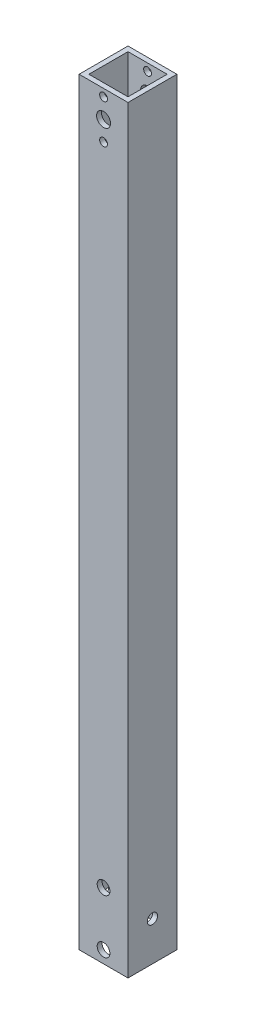
ISO-10303-21;
HEADER;
FILE_DESCRIPTION(('STEP AP214'),'2;1');
FILE_NAME('part.step','',(''),(''),'','','');
FILE_SCHEMA(('AUTOMOTIVE_DESIGN { 1 0 10303 214 1 1 1 1 }'));
ENDSEC;
DATA;
#1=APPLICATION_CONTEXT('core data for automotive mechanical design processes');
#2=APPLICATION_PROTOCOL_DEFINITION('international standard','automotive_design',2000,#1);
#3=PRODUCT_CONTEXT('',#1,'mechanical');
#4=PRODUCT('Part','Part','',(#3));
#5=PRODUCT_RELATED_PRODUCT_CATEGORY('part','',(#4));
#6=PRODUCT_DEFINITION_FORMATION('','',#4);
#7=PRODUCT_DEFINITION_CONTEXT('part definition',#1,'design');
#8=PRODUCT_DEFINITION('design','',#6,#7);
#9=PRODUCT_DEFINITION_SHAPE('','',#8);
#10=(LENGTH_UNIT() NAMED_UNIT(*) SI_UNIT(.MILLI.,.METRE.));
#11=(NAMED_UNIT(*) PLANE_ANGLE_UNIT() SI_UNIT($,.RADIAN.));
#12=(NAMED_UNIT(*) SI_UNIT($,.STERADIAN.) SOLID_ANGLE_UNIT());
#13=UNCERTAINTY_MEASURE_WITH_UNIT(LENGTH_MEASURE(1.E-05),#10,'distance_accuracy_value','');
#14=(GEOMETRIC_REPRESENTATION_CONTEXT(3) GLOBAL_UNCERTAINTY_ASSIGNED_CONTEXT((#13)) GLOBAL_UNIT_ASSIGNED_CONTEXT((#10,
#11,#12)) REPRESENTATION_CONTEXT('',''));
#15=CARTESIAN_POINT('',(0.,0.,0.));
#16=DIRECTION('',(0.,0.,1.));
#17=DIRECTION('',(1.,0.,0.));
#18=AXIS2_PLACEMENT_3D('',#15,#16,#17);
#19=CARTESIAN_POINT('',(0.,310.,0.));
#20=DIRECTION('',(0.,1.,0.));
#21=DIRECTION('',(0.,0.,1.));
#22=AXIS2_PLACEMENT_3D('',#19,#20,#21);
#23=PLANE('',#22);
#24=DIRECTION('',(0.,0.,1.));
#25=VECTOR('',#24,1.);
#26=CARTESIAN_POINT('',(0.,310.,0.));
#27=LINE('',#26,#25);
#28=CARTESIAN_POINT('',(0.,310.,-20.));
#29=VERTEX_POINT('',#28);
#30=CARTESIAN_POINT('',(0.,310.,0.));
#31=VERTEX_POINT('',#30);
#32=EDGE_CURVE('E162',#29,#31,#27,.T.);
#33=ORIENTED_EDGE('',*,*,#32,.T.);
#34=DIRECTION('',(1.,0.,0.));
#35=VECTOR('',#34,1.);
#36=CARTESIAN_POINT('',(0.,310.,0.));
#37=LINE('',#36,#35);
#38=CARTESIAN_POINT('',(20.,310.,0.));
#39=VERTEX_POINT('',#38);
#40=EDGE_CURVE('E165',#31,#39,#37,.T.);
#41=ORIENTED_EDGE('',*,*,#40,.T.);
#42=DIRECTION('',(0.,0.,-1.));
#43=VECTOR('',#42,1.);
#44=CARTESIAN_POINT('',(20.,310.,0.));
#45=LINE('',#44,#43);
#46=CARTESIAN_POINT('',(20.,310.,-20.));
#47=VERTEX_POINT('',#46);
#48=EDGE_CURVE('E168',#39,#47,#45,.T.);
#49=ORIENTED_EDGE('',*,*,#48,.T.);
#50=DIRECTION('',(-1.,0.,0.));
#51=VECTOR('',#50,1.);
#52=CARTESIAN_POINT('',(0.,310.,-20.));
#53=LINE('',#52,#51);
#54=EDGE_CURVE('E170',#47,#29,#53,.T.);
#55=ORIENTED_EDGE('',*,*,#54,.T.);
#56=EDGE_LOOP('',(#33,#41,#49,#55));
#57=FACE_BOUND('',#56,.T.);
#58=DIRECTION('',(1.,0.,0.));
#59=VECTOR('',#58,1.);
#60=CARTESIAN_POINT('',(0.,310.,-2.));
#61=LINE('',#60,#59);
#62=CARTESIAN_POINT('',(2.,310.,-2.));
#63=VERTEX_POINT('',#62);
#64=CARTESIAN_POINT('',(18.,310.,-2.));
#65=VERTEX_POINT('',#64);
#66=EDGE_CURVE('E132',#63,#65,#61,.T.);
#67=ORIENTED_EDGE('',*,*,#66,.F.);
#68=DIRECTION('',(0.,0.,1.));
#69=VECTOR('',#68,1.);
#70=CARTESIAN_POINT('',(2.,310.,0.));
#71=LINE('',#70,#69);
#72=CARTESIAN_POINT('',(2.,310.,-18.));
#73=VERTEX_POINT('',#72);
#74=EDGE_CURVE('E124',#73,#63,#71,.T.);
#75=ORIENTED_EDGE('',*,*,#74,.F.);
#76=DIRECTION('',(-1.,0.,0.));
#77=VECTOR('',#76,1.);
#78=CARTESIAN_POINT('',(0.,310.,-18.));
#79=LINE('',#78,#77);
#80=CARTESIAN_POINT('',(18.,310.,-18.));
#81=VERTEX_POINT('',#80);
#82=EDGE_CURVE('E146',#81,#73,#79,.T.);
#83=ORIENTED_EDGE('',*,*,#82,.F.);
#84=DIRECTION('',(0.,0.,-1.));
#85=VECTOR('',#84,1.);
#86=CARTESIAN_POINT('',(18.,310.,0.));
#87=LINE('',#86,#85);
#88=EDGE_CURVE('E144',#65,#81,#87,.T.);
#89=ORIENTED_EDGE('',*,*,#88,.F.);
#90=EDGE_LOOP('',(#67,#75,#83,#89));
#91=FACE_BOUND('',#90,.T.);
#92=ADVANCED_FACE('F57',(#57,#91),#23,.T.);
#93=CARTESIAN_POINT('',(0.,0.,0.));
#94=DIRECTION('',(0.,1.,0.));
#95=DIRECTION('',(0.,0.,1.));
#96=AXIS2_PLACEMENT_3D('',#93,#94,#95);
#97=PLANE('',#96);
#98=DIRECTION('',(0.,0.,1.));
#99=VECTOR('',#98,1.);
#100=CARTESIAN_POINT('',(0.,0.,0.));
#101=LINE('',#100,#99);
#102=CARTESIAN_POINT('',(0.,0.,-20.));
#103=VERTEX_POINT('',#102);
#104=CARTESIAN_POINT('',(0.,0.,0.));
#105=VERTEX_POINT('',#104);
#106=EDGE_CURVE('E140',#103,#105,#101,.T.);
#107=ORIENTED_EDGE('',*,*,#106,.F.);
#108=DIRECTION('',(-1.,0.,0.));
#109=VECTOR('',#108,1.);
#110=CARTESIAN_POINT('',(0.,0.,-20.));
#111=LINE('',#110,#109);
#112=CARTESIAN_POINT('',(20.,0.,-20.));
#113=VERTEX_POINT('',#112);
#114=EDGE_CURVE('E166',#113,#103,#111,.T.);
#115=ORIENTED_EDGE('',*,*,#114,.F.);
#116=DIRECTION('',(0.,0.,-1.));
#117=VECTOR('',#116,1.);
#118=CARTESIAN_POINT('',(20.,0.,0.));
#119=LINE('',#118,#117);
#120=CARTESIAN_POINT('',(20.,0.,0.));
#121=VERTEX_POINT('',#120);
#122=EDGE_CURVE('E177',#121,#113,#119,.T.);
#123=ORIENTED_EDGE('',*,*,#122,.F.);
#124=DIRECTION('',(1.,0.,0.));
#125=VECTOR('',#124,1.);
#126=CARTESIAN_POINT('',(0.,0.,0.));
#127=LINE('',#126,#125);
#128=EDGE_CURVE('E175',#105,#121,#127,.T.);
#129=ORIENTED_EDGE('',*,*,#128,.F.);
#130=EDGE_LOOP('',(#107,#115,#123,#129));
#131=FACE_BOUND('',#130,.T.);
#132=DIRECTION('',(0.,0.,1.));
#133=VECTOR('',#132,1.);
#134=CARTESIAN_POINT('',(2.,0.,0.));
#135=LINE('',#134,#133);
#136=CARTESIAN_POINT('',(2.,0.,-18.));
#137=VERTEX_POINT('',#136);
#138=CARTESIAN_POINT('',(2.,0.,-2.));
#139=VERTEX_POINT('',#138);
#140=EDGE_CURVE('E82',#137,#139,#135,.T.);
#141=ORIENTED_EDGE('',*,*,#140,.T.);
#142=DIRECTION('',(1.,0.,0.));
#143=VECTOR('',#142,1.);
#144=CARTESIAN_POINT('',(0.,0.,-2.));
#145=LINE('',#144,#143);
#146=CARTESIAN_POINT('',(18.,0.,-2.));
#147=VERTEX_POINT('',#146);
#148=EDGE_CURVE('E139',#139,#147,#145,.T.);
#149=ORIENTED_EDGE('',*,*,#148,.T.);
#150=DIRECTION('',(0.,0.,-1.));
#151=VECTOR('',#150,1.);
#152=CARTESIAN_POINT('',(18.,0.,0.));
#153=LINE('',#152,#151);
#154=CARTESIAN_POINT('',(18.,0.,-18.));
#155=VERTEX_POINT('',#154);
#156=EDGE_CURVE('E154',#147,#155,#153,.T.);
#157=ORIENTED_EDGE('',*,*,#156,.T.);
#158=DIRECTION('',(-1.,0.,0.));
#159=VECTOR('',#158,1.);
#160=CARTESIAN_POINT('',(0.,0.,-18.));
#161=LINE('',#160,#159);
#162=EDGE_CURVE('E133',#155,#137,#161,.T.);
#163=ORIENTED_EDGE('',*,*,#162,.T.);
#164=EDGE_LOOP('',(#141,#149,#157,#163));
#165=FACE_BOUND('',#164,.T.);
#166=ADVANCED_FACE('F276',(#131,#165),#97,.F.);
#167=CARTESIAN_POINT('',(0.,310.,0.));
#168=DIRECTION('',(1.,0.,0.));
#169=DIRECTION('',(0.,0.,-1.));
#170=AXIS2_PLACEMENT_3D('',#167,#168,#169);
#171=PLANE('',#170);
#172=CARTESIAN_POINT('',(0.,16.,-10.));
#173=DIRECTION('',(-1.,0.,0.));
#174=DIRECTION('',(0.,0.,1.));
#175=AXIS2_PLACEMENT_3D('',#172,#173,#174);
#176=CIRCLE('',#175,2.1);
#177=CARTESIAN_POINT('',(0.,16.,-7.9));
#178=VERTEX_POINT('',#177);
#179=EDGE_CURVE('E304',#178,#178,#176,.T.);
#180=ORIENTED_EDGE('',*,*,#179,.F.);
#181=EDGE_LOOP('',(#180));
#182=FACE_BOUND('',#181,.T.);
#183=ORIENTED_EDGE('',*,*,#106,.T.);
#184=DIRECTION('',(0.,-1.,0.));
#185=VECTOR('',#184,1.);
#186=CARTESIAN_POINT('',(0.,310.,0.));
#187=LINE('',#186,#185);
#188=EDGE_CURVE('E12',#31,#105,#187,.T.);
#189=ORIENTED_EDGE('',*,*,#188,.F.);
#190=ORIENTED_EDGE('',*,*,#32,.F.);
#191=DIRECTION('',(0.,-1.,0.));
#192=VECTOR('',#191,1.);
#193=CARTESIAN_POINT('',(0.,310.,-20.));
#194=LINE('',#193,#192);
#195=EDGE_CURVE('E172',#29,#103,#194,.T.);
#196=ORIENTED_EDGE('',*,*,#195,.T.);
#197=EDGE_LOOP('',(#183,#189,#190,#196));
#198=FACE_BOUND('',#197,.T.);
#199=ADVANCED_FACE('F59',(#182,#198),#171,.F.);
#200=CARTESIAN_POINT('',(0.,310.,0.));
#201=DIRECTION('',(0.,0.,-1.));
#202=DIRECTION('',(-1.,0.,0.));
#203=AXIS2_PLACEMENT_3D('',#200,#201,#202);
#204=PLANE('',#203);
#205=CARTESIAN_POINT('',(10.0000000000021,5.00000000000006,0.));
#206=DIRECTION('',(0.,0.,-1.));
#207=DIRECTION('',(-1.,0.,0.));
#208=AXIS2_PLACEMENT_3D('',#205,#206,#207);
#209=CIRCLE('',#208,2.6);
#210=CARTESIAN_POINT('',(7.40000000000211,5.00000000000006,0.));
#211=VERTEX_POINT('',#210);
#212=EDGE_CURVE('E202',#211,#211,#209,.T.);
#213=ORIENTED_EDGE('',*,*,#212,.T.);
#214=EDGE_LOOP('',(#213));
#215=FACE_BOUND('',#214,.T.);
#216=CARTESIAN_POINT('',(10.0000000000021,27.,0.));
#217=DIRECTION('',(0.,0.,-1.));
#218=DIRECTION('',(-1.,0.,0.));
#219=AXIS2_PLACEMENT_3D('',#216,#217,#218);
#220=CIRCLE('',#219,2.6);
#221=CARTESIAN_POINT('',(7.4000000000021,27.,0.));
#222=VERTEX_POINT('',#221);
#223=EDGE_CURVE('E317',#222,#222,#220,.T.);
#224=ORIENTED_EDGE('',*,*,#223,.T.);
#225=EDGE_LOOP('',(#224));
#226=FACE_BOUND('',#225,.T.);
#227=CARTESIAN_POINT('',(10.,307.,0.));
#228=DIRECTION('',(0.,0.,1.));
#229=DIRECTION('',(1.,0.,0.));
#230=AXIS2_PLACEMENT_3D('',#227,#228,#229);
#231=CIRCLE('',#230,1.59999999999999);
#232=CARTESIAN_POINT('',(11.6,307.,0.));
#233=VERTEX_POINT('',#232);
#234=EDGE_CURVE('E209',#233,#233,#231,.T.);
#235=ORIENTED_EDGE('',*,*,#234,.F.);
#236=EDGE_LOOP('',(#235));
#237=FACE_BOUND('',#236,.T.);
#238=CARTESIAN_POINT('',(10.,291.,0.));
#239=DIRECTION('',(0.,0.,1.));
#240=DIRECTION('',(1.,0.,0.));
#241=AXIS2_PLACEMENT_3D('',#238,#239,#240);
#242=CIRCLE('',#241,1.6);
#243=CARTESIAN_POINT('',(11.6,291.,0.));
#244=VERTEX_POINT('',#243);
#245=EDGE_CURVE('E223',#244,#244,#242,.T.);
#246=ORIENTED_EDGE('',*,*,#245,.F.);
#247=EDGE_LOOP('',(#246));
#248=FACE_BOUND('',#247,.T.);
#249=CARTESIAN_POINT('',(10.,299.,0.));
#250=DIRECTION('',(0.,0.,1.));
#251=DIRECTION('',(1.,0.,0.));
#252=AXIS2_PLACEMENT_3D('',#249,#250,#251);
#253=CIRCLE('',#252,2.84999999999999);
#254=CARTESIAN_POINT('',(12.85,299.,0.));
#255=VERTEX_POINT('',#254);
#256=EDGE_CURVE('E222',#255,#255,#253,.T.);
#257=ORIENTED_EDGE('',*,*,#256,.F.);
#258=EDGE_LOOP('',(#257));
#259=FACE_BOUND('',#258,.T.);
#260=ORIENTED_EDGE('',*,*,#128,.T.);
#261=DIRECTION('',(0.,-1.,0.));
#262=VECTOR('',#261,1.);
#263=CARTESIAN_POINT('',(20.,310.,0.));
#264=LINE('',#263,#262);
#265=EDGE_CURVE('E66',#39,#121,#264,.T.);
#266=ORIENTED_EDGE('',*,*,#265,.F.);
#267=ORIENTED_EDGE('',*,*,#40,.F.);
#268=ORIENTED_EDGE('',*,*,#188,.T.);
#269=EDGE_LOOP('',(#260,#266,#267,#268));
#270=FACE_BOUND('',#269,.T.);
#271=ADVANCED_FACE('F262',(#215,#226,#237,#248,#259,#270),#204,.F.);
#272=CARTESIAN_POINT('',(20.,310.,0.));
#273=DIRECTION('',(-1.,0.,0.));
#274=DIRECTION('',(0.,0.,1.));
#275=AXIS2_PLACEMENT_3D('',#272,#273,#274);
#276=PLANE('',#275);
#277=CARTESIAN_POINT('',(20.,16.,-10.));
#278=DIRECTION('',(-1.,0.,0.));
#279=DIRECTION('',(0.,0.,1.));
#280=AXIS2_PLACEMENT_3D('',#277,#278,#279);
#281=CIRCLE('',#280,2.1);
#282=CARTESIAN_POINT('',(20.,16.,-7.9));
#283=VERTEX_POINT('',#282);
#284=EDGE_CURVE('E302',#283,#283,#281,.T.);
#285=ORIENTED_EDGE('',*,*,#284,.T.);
#286=EDGE_LOOP('',(#285));
#287=FACE_BOUND('',#286,.T.);
#288=ORIENTED_EDGE('',*,*,#122,.T.);
#289=DIRECTION('',(0.,-1.,0.));
#290=VECTOR('',#289,1.);
#291=CARTESIAN_POINT('',(20.,310.,-20.));
#292=LINE('',#291,#290);
#293=EDGE_CURVE('E182',#47,#113,#292,.T.);
#294=ORIENTED_EDGE('',*,*,#293,.F.);
#295=ORIENTED_EDGE('',*,*,#48,.F.);
#296=ORIENTED_EDGE('',*,*,#265,.T.);
#297=EDGE_LOOP('',(#288,#294,#295,#296));
#298=FACE_BOUND('',#297,.T.);
#299=ADVANCED_FACE('F265',(#287,#298),#276,.F.);
#300=CARTESIAN_POINT('',(0.,310.,-20.));
#301=DIRECTION('',(0.,0.,1.));
#302=DIRECTION('',(1.,0.,0.));
#303=AXIS2_PLACEMENT_3D('',#300,#301,#302);
#304=PLANE('',#303);
#305=CARTESIAN_POINT('',(10.0000000000021,5.00000000000006,-20.));
#306=DIRECTION('',(0.,0.,-1.));
#307=DIRECTION('',(-1.,0.,0.));
#308=AXIS2_PLACEMENT_3D('',#305,#306,#307);
#309=CIRCLE('',#308,2.6);
#310=CARTESIAN_POINT('',(7.40000000000211,5.00000000000006,-20.));
#311=VERTEX_POINT('',#310);
#312=EDGE_CURVE('E315',#311,#311,#309,.T.);
#313=ORIENTED_EDGE('',*,*,#312,.F.);
#314=EDGE_LOOP('',(#313));
#315=FACE_BOUND('',#314,.T.);
#316=CARTESIAN_POINT('',(10.0000000000021,27.,-20.));
#317=DIRECTION('',(0.,0.,-1.));
#318=DIRECTION('',(-1.,0.,0.));
#319=AXIS2_PLACEMENT_3D('',#316,#317,#318);
#320=CIRCLE('',#319,2.6);
#321=CARTESIAN_POINT('',(7.4000000000021,27.,-20.));
#322=VERTEX_POINT('',#321);
#323=EDGE_CURVE('E216',#322,#322,#320,.T.);
#324=ORIENTED_EDGE('',*,*,#323,.F.);
#325=EDGE_LOOP('',(#324));
#326=FACE_BOUND('',#325,.T.);
#327=CARTESIAN_POINT('',(10.,307.,-20.));
#328=DIRECTION('',(0.,0.,1.));
#329=DIRECTION('',(1.,0.,0.));
#330=AXIS2_PLACEMENT_3D('',#327,#328,#329);
#331=CIRCLE('',#330,1.59999999999999);
#332=CARTESIAN_POINT('',(11.6,307.,-20.));
#333=VERTEX_POINT('',#332);
#334=EDGE_CURVE('E226',#333,#333,#331,.T.);
#335=ORIENTED_EDGE('',*,*,#334,.T.);
#336=EDGE_LOOP('',(#335));
#337=FACE_BOUND('',#336,.T.);
#338=CARTESIAN_POINT('',(10.,291.,-20.));
#339=DIRECTION('',(0.,0.,1.));
#340=DIRECTION('',(1.,0.,0.));
#341=AXIS2_PLACEMENT_3D('',#338,#339,#340);
#342=CIRCLE('',#341,1.6);
#343=CARTESIAN_POINT('',(11.6,291.,-20.));
#344=VERTEX_POINT('',#343);
#345=EDGE_CURVE('E219',#344,#344,#342,.T.);
#346=ORIENTED_EDGE('',*,*,#345,.T.);
#347=EDGE_LOOP('',(#346));
#348=FACE_BOUND('',#347,.T.);
#349=CARTESIAN_POINT('',(10.,299.,-20.));
#350=DIRECTION('',(0.,0.,1.));
#351=DIRECTION('',(1.,0.,0.));
#352=AXIS2_PLACEMENT_3D('',#349,#350,#351);
#353=CIRCLE('',#352,2.84999999999999);
#354=CARTESIAN_POINT('',(12.85,299.,-20.));
#355=VERTEX_POINT('',#354);
#356=EDGE_CURVE('E191',#355,#355,#353,.T.);
#357=ORIENTED_EDGE('',*,*,#356,.T.);
#358=EDGE_LOOP('',(#357));
#359=FACE_BOUND('',#358,.T.);
#360=ORIENTED_EDGE('',*,*,#114,.T.);
#361=ORIENTED_EDGE('',*,*,#195,.F.);
#362=ORIENTED_EDGE('',*,*,#54,.F.);
#363=ORIENTED_EDGE('',*,*,#293,.T.);
#364=EDGE_LOOP('',(#360,#361,#362,#363));
#365=FACE_BOUND('',#364,.T.);
#366=ADVANCED_FACE('F280',(#315,#326,#337,#348,#359,#365),#304,.F.);
#367=CARTESIAN_POINT('',(2.,310.,0.));
#368=DIRECTION('',(1.,0.,0.));
#369=DIRECTION('',(0.,0.,-1.));
#370=AXIS2_PLACEMENT_3D('',#367,#368,#369);
#371=PLANE('',#370);
#372=CARTESIAN_POINT('',(2.,16.,-10.));
#373=DIRECTION('',(1.,0.,0.));
#374=DIRECTION('',(0.,0.,-1.));
#375=AXIS2_PLACEMENT_3D('',#372,#373,#374);
#376=CIRCLE('',#375,2.1);
#377=CARTESIAN_POINT('',(2.,16.,-12.1));
#378=VERTEX_POINT('',#377);
#379=EDGE_CURVE('E307',#378,#378,#376,.T.);
#380=ORIENTED_EDGE('',*,*,#379,.F.);
#381=EDGE_LOOP('',(#380));
#382=FACE_BOUND('',#381,.T.);
#383=ORIENTED_EDGE('',*,*,#140,.F.);
#384=DIRECTION('',(0.,-1.,0.));
#385=VECTOR('',#384,1.);
#386=CARTESIAN_POINT('',(2.,310.,-18.));
#387=LINE('',#386,#385);
#388=EDGE_CURVE('E128',#73,#137,#387,.T.);
#389=ORIENTED_EDGE('',*,*,#388,.F.);
#390=ORIENTED_EDGE('',*,*,#74,.T.);
#391=DIRECTION('',(0.,-1.,0.));
#392=VECTOR('',#391,1.);
#393=CARTESIAN_POINT('',(2.,310.,-2.));
#394=LINE('',#393,#392);
#395=EDGE_CURVE('E127',#63,#139,#394,.T.);
#396=ORIENTED_EDGE('',*,*,#395,.T.);
#397=EDGE_LOOP('',(#383,#389,#390,#396));
#398=FACE_BOUND('',#397,.T.);
#399=ADVANCED_FACE('F126',(#382,#398),#371,.T.);
#400=CARTESIAN_POINT('',(0.,310.,-2.));
#401=DIRECTION('',(0.,0.,-1.));
#402=DIRECTION('',(-1.,0.,0.));
#403=AXIS2_PLACEMENT_3D('',#400,#401,#402);
#404=PLANE('',#403);
#405=CARTESIAN_POINT('',(10.0000000000021,5.00000000000006,-2.));
#406=DIRECTION('',(0.,0.,-1.));
#407=DIRECTION('',(-1.,0.,0.));
#408=AXIS2_PLACEMENT_3D('',#405,#406,#407);
#409=CIRCLE('',#408,2.6);
#410=CARTESIAN_POINT('',(7.40000000000211,5.00000000000006,-2.));
#411=VERTEX_POINT('',#410);
#412=EDGE_CURVE('E205',#411,#411,#409,.T.);
#413=ORIENTED_EDGE('',*,*,#412,.F.);
#414=EDGE_LOOP('',(#413));
#415=FACE_BOUND('',#414,.T.);
#416=CARTESIAN_POINT('',(10.0000000000021,27.,-2.));
#417=DIRECTION('',(0.,0.,-1.));
#418=DIRECTION('',(-1.,0.,0.));
#419=AXIS2_PLACEMENT_3D('',#416,#417,#418);
#420=CIRCLE('',#419,2.6);
#421=CARTESIAN_POINT('',(7.4000000000021,27.,-2.));
#422=VERTEX_POINT('',#421);
#423=EDGE_CURVE('E201',#422,#422,#420,.T.);
#424=ORIENTED_EDGE('',*,*,#423,.F.);
#425=EDGE_LOOP('',(#424));
#426=FACE_BOUND('',#425,.T.);
#427=CARTESIAN_POINT('',(10.,307.,-2.));
#428=DIRECTION('',(0.,0.,-1.));
#429=DIRECTION('',(-1.,0.,0.));
#430=AXIS2_PLACEMENT_3D('',#427,#428,#429);
#431=CIRCLE('',#430,1.59999999999999);
#432=CARTESIAN_POINT('',(8.40000000000001,307.,-2.));
#433=VERTEX_POINT('',#432);
#434=EDGE_CURVE('E152',#433,#433,#431,.T.);
#435=ORIENTED_EDGE('',*,*,#434,.F.);
#436=EDGE_LOOP('',(#435));
#437=FACE_BOUND('',#436,.T.);
#438=CARTESIAN_POINT('',(10.,291.,-2.));
#439=DIRECTION('',(0.,0.,-1.));
#440=DIRECTION('',(-1.,0.,0.));
#441=AXIS2_PLACEMENT_3D('',#438,#439,#440);
#442=CIRCLE('',#441,1.6);
#443=CARTESIAN_POINT('',(8.40000000000001,291.,-2.));
#444=VERTEX_POINT('',#443);
#445=EDGE_CURVE('E195',#444,#444,#442,.T.);
#446=ORIENTED_EDGE('',*,*,#445,.F.);
#447=EDGE_LOOP('',(#446));
#448=FACE_BOUND('',#447,.T.);
#449=CARTESIAN_POINT('',(10.,299.,-2.));
#450=DIRECTION('',(0.,0.,-1.));
#451=DIRECTION('',(-1.,0.,0.));
#452=AXIS2_PLACEMENT_3D('',#449,#450,#451);
#453=CIRCLE('',#452,2.84999999999999);
#454=CARTESIAN_POINT('',(7.15000000000001,299.,-2.));
#455=VERTEX_POINT('',#454);
#456=EDGE_CURVE('E190',#455,#455,#453,.T.);
#457=ORIENTED_EDGE('',*,*,#456,.F.);
#458=EDGE_LOOP('',(#457));
#459=FACE_BOUND('',#458,.T.);
#460=ORIENTED_EDGE('',*,*,#148,.F.);
#461=ORIENTED_EDGE('',*,*,#395,.F.);
#462=ORIENTED_EDGE('',*,*,#66,.T.);
#463=DIRECTION('',(0.,-1.,0.));
#464=VECTOR('',#463,1.);
#465=CARTESIAN_POINT('',(18.,310.,-2.));
#466=LINE('',#465,#464);
#467=EDGE_CURVE('E141',#65,#147,#466,.T.);
#468=ORIENTED_EDGE('',*,*,#467,.T.);
#469=EDGE_LOOP('',(#460,#461,#462,#468));
#470=FACE_BOUND('',#469,.T.);
#471=ADVANCED_FACE('F136',(#415,#426,#437,#448,#459,#470),#404,.T.);
#472=CARTESIAN_POINT('',(18.,310.,0.));
#473=DIRECTION('',(-1.,0.,0.));
#474=DIRECTION('',(0.,0.,1.));
#475=AXIS2_PLACEMENT_3D('',#472,#473,#474);
#476=PLANE('',#475);
#477=CARTESIAN_POINT('',(18.,16.,-10.));
#478=DIRECTION('',(-1.,0.,0.));
#479=DIRECTION('',(0.,0.,1.));
#480=AXIS2_PLACEMENT_3D('',#477,#478,#479);
#481=CIRCLE('',#480,2.1);
#482=CARTESIAN_POINT('',(18.,16.,-7.9));
#483=VERTEX_POINT('',#482);
#484=EDGE_CURVE('E61',#483,#483,#481,.T.);
#485=ORIENTED_EDGE('',*,*,#484,.F.);
#486=EDGE_LOOP('',(#485));
#487=FACE_BOUND('',#486,.T.);
#488=ORIENTED_EDGE('',*,*,#156,.F.);
#489=ORIENTED_EDGE('',*,*,#467,.F.);
#490=ORIENTED_EDGE('',*,*,#88,.T.);
#491=DIRECTION('',(0.,-1.,0.));
#492=VECTOR('',#491,1.);
#493=CARTESIAN_POINT('',(18.,310.,-18.));
#494=LINE('',#493,#492);
#495=EDGE_CURVE('E74',#81,#155,#494,.T.);
#496=ORIENTED_EDGE('',*,*,#495,.T.);
#497=EDGE_LOOP('',(#488,#489,#490,#496));
#498=FACE_BOUND('',#497,.T.);
#499=ADVANCED_FACE('F246',(#487,#498),#476,.T.);
#500=CARTESIAN_POINT('',(0.,310.,-18.));
#501=DIRECTION('',(0.,0.,1.));
#502=DIRECTION('',(1.,0.,0.));
#503=AXIS2_PLACEMENT_3D('',#500,#501,#502);
#504=PLANE('',#503);
#505=CARTESIAN_POINT('',(10.0000000000021,5.00000000000006,-18.));
#506=DIRECTION('',(0.,0.,1.));
#507=DIRECTION('',(1.,0.,0.));
#508=AXIS2_PLACEMENT_3D('',#505,#506,#507);
#509=CIRCLE('',#508,2.6);
#510=CARTESIAN_POINT('',(12.6000000000021,5.00000000000006,-18.));
#511=VERTEX_POINT('',#510);
#512=EDGE_CURVE('E203',#511,#511,#509,.T.);
#513=ORIENTED_EDGE('',*,*,#512,.F.);
#514=EDGE_LOOP('',(#513));
#515=FACE_BOUND('',#514,.T.);
#516=CARTESIAN_POINT('',(10.0000000000021,27.,-18.));
#517=DIRECTION('',(0.,0.,1.));
#518=DIRECTION('',(1.,0.,0.));
#519=AXIS2_PLACEMENT_3D('',#516,#517,#518);
#520=CIRCLE('',#519,2.6);
#521=CARTESIAN_POINT('',(12.6000000000021,27.,-18.));
#522=VERTEX_POINT('',#521);
#523=EDGE_CURVE('E199',#522,#522,#520,.T.);
#524=ORIENTED_EDGE('',*,*,#523,.F.);
#525=EDGE_LOOP('',(#524));
#526=FACE_BOUND('',#525,.T.);
#527=CARTESIAN_POINT('',(10.,307.,-18.));
#528=DIRECTION('',(0.,0.,1.));
#529=DIRECTION('',(1.,0.,0.));
#530=AXIS2_PLACEMENT_3D('',#527,#528,#529);
#531=CIRCLE('',#530,1.59999999999999);
#532=CARTESIAN_POINT('',(11.6,307.,-18.));
#533=VERTEX_POINT('',#532);
#534=EDGE_CURVE('E196',#533,#533,#531,.T.);
#535=ORIENTED_EDGE('',*,*,#534,.F.);
#536=EDGE_LOOP('',(#535));
#537=FACE_BOUND('',#536,.T.);
#538=CARTESIAN_POINT('',(10.,291.,-18.));
#539=DIRECTION('',(0.,0.,1.));
#540=DIRECTION('',(1.,0.,0.));
#541=AXIS2_PLACEMENT_3D('',#538,#539,#540);
#542=CIRCLE('',#541,1.6);
#543=CARTESIAN_POINT('',(11.6,291.,-18.));
#544=VERTEX_POINT('',#543);
#545=EDGE_CURVE('E192',#544,#544,#542,.T.);
#546=ORIENTED_EDGE('',*,*,#545,.F.);
#547=EDGE_LOOP('',(#546));
#548=FACE_BOUND('',#547,.T.);
#549=CARTESIAN_POINT('',(10.,299.,-18.));
#550=DIRECTION('',(0.,0.,1.));
#551=DIRECTION('',(1.,0.,0.));
#552=AXIS2_PLACEMENT_3D('',#549,#550,#551);
#553=CIRCLE('',#552,2.84999999999999);
#554=CARTESIAN_POINT('',(12.85,299.,-18.));
#555=VERTEX_POINT('',#554);
#556=EDGE_CURVE('E187',#555,#555,#553,.T.);
#557=ORIENTED_EDGE('',*,*,#556,.F.);
#558=EDGE_LOOP('',(#557));
#559=FACE_BOUND('',#558,.T.);
#560=ORIENTED_EDGE('',*,*,#162,.F.);
#561=ORIENTED_EDGE('',*,*,#495,.F.);
#562=ORIENTED_EDGE('',*,*,#82,.T.);
#563=ORIENTED_EDGE('',*,*,#388,.T.);
#564=EDGE_LOOP('',(#560,#561,#562,#563));
#565=FACE_BOUND('',#564,.T.);
#566=ADVANCED_FACE('F335',(#515,#526,#537,#548,#559,#565),#504,.T.);
#567=CARTESIAN_POINT('',(10.,299.,-20.));
#568=DIRECTION('',(0.,0.,1.));
#569=DIRECTION('',(1.,0.,0.));
#570=AXIS2_PLACEMENT_3D('',#567,#568,#569);
#571=CYLINDRICAL_SURFACE('',#570,2.84999999999999);
#572=ORIENTED_EDGE('',*,*,#556,.T.);
#573=EDGE_LOOP('',(#572));
#574=FACE_BOUND('',#573,.T.);
#575=ORIENTED_EDGE('',*,*,#356,.F.);
#576=EDGE_LOOP('',(#575));
#577=FACE_BOUND('',#576,.T.);
#578=ADVANCED_FACE('F259',(#574,#577),#571,.F.);
#579=CARTESIAN_POINT('',(10.,291.,-20.));
#580=DIRECTION('',(0.,0.,1.));
#581=DIRECTION('',(1.,0.,0.));
#582=AXIS2_PLACEMENT_3D('',#579,#580,#581);
#583=CYLINDRICAL_SURFACE('',#582,1.6);
#584=ORIENTED_EDGE('',*,*,#545,.T.);
#585=EDGE_LOOP('',(#584));
#586=FACE_BOUND('',#585,.T.);
#587=ORIENTED_EDGE('',*,*,#345,.F.);
#588=EDGE_LOOP('',(#587));
#589=FACE_BOUND('',#588,.T.);
#590=ADVANCED_FACE('F334',(#586,#589),#583,.F.);
#591=CARTESIAN_POINT('',(10.,307.,-20.));
#592=DIRECTION('',(0.,0.,1.));
#593=DIRECTION('',(1.,0.,0.));
#594=AXIS2_PLACEMENT_3D('',#591,#592,#593);
#595=CYLINDRICAL_SURFACE('',#594,1.59999999999999);
#596=ORIENTED_EDGE('',*,*,#534,.T.);
#597=EDGE_LOOP('',(#596));
#598=FACE_BOUND('',#597,.T.);
#599=ORIENTED_EDGE('',*,*,#334,.F.);
#600=EDGE_LOOP('',(#599));
#601=FACE_BOUND('',#600,.T.);
#602=ADVANCED_FACE('F257',(#598,#601),#595,.F.);
#603=ORIENTED_EDGE('',*,*,#456,.T.);
#604=EDGE_LOOP('',(#603));
#605=FACE_BOUND('',#604,.T.);
#606=ORIENTED_EDGE('',*,*,#256,.T.);
#607=EDGE_LOOP('',(#606));
#608=FACE_BOUND('',#607,.T.);
#609=ADVANCED_FACE('F253',(#605,#608),#571,.F.);
#610=ORIENTED_EDGE('',*,*,#445,.T.);
#611=EDGE_LOOP('',(#610));
#612=FACE_BOUND('',#611,.T.);
#613=ORIENTED_EDGE('',*,*,#245,.T.);
#614=EDGE_LOOP('',(#613));
#615=FACE_BOUND('',#614,.T.);
#616=ADVANCED_FACE('F256',(#612,#615),#583,.F.);
#617=ORIENTED_EDGE('',*,*,#434,.T.);
#618=EDGE_LOOP('',(#617));
#619=FACE_BOUND('',#618,.T.);
#620=ORIENTED_EDGE('',*,*,#234,.T.);
#621=EDGE_LOOP('',(#620));
#622=FACE_BOUND('',#621,.T.);
#623=ADVANCED_FACE('F241',(#619,#622),#595,.F.);
#624=CARTESIAN_POINT('',(10.0000000000021,27.,0.));
#625=DIRECTION('',(0.,0.,-1.));
#626=DIRECTION('',(-1.,0.,0.));
#627=AXIS2_PLACEMENT_3D('',#624,#625,#626);
#628=CYLINDRICAL_SURFACE('',#627,2.6);
#629=ORIENTED_EDGE('',*,*,#523,.T.);
#630=EDGE_LOOP('',(#629));
#631=FACE_BOUND('',#630,.T.);
#632=ORIENTED_EDGE('',*,*,#323,.T.);
#633=EDGE_LOOP('',(#632));
#634=FACE_BOUND('',#633,.T.);
#635=ADVANCED_FACE('F324',(#631,#634),#628,.F.);
#636=CARTESIAN_POINT('',(10.0000000000021,5.00000000000006,0.));
#637=DIRECTION('',(0.,0.,-1.));
#638=DIRECTION('',(-1.,0.,0.));
#639=AXIS2_PLACEMENT_3D('',#636,#637,#638);
#640=CYLINDRICAL_SURFACE('',#639,2.6);
#641=ORIENTED_EDGE('',*,*,#512,.T.);
#642=EDGE_LOOP('',(#641));
#643=FACE_BOUND('',#642,.T.);
#644=ORIENTED_EDGE('',*,*,#312,.T.);
#645=EDGE_LOOP('',(#644));
#646=FACE_BOUND('',#645,.T.);
#647=ADVANCED_FACE('F368',(#643,#646),#640,.F.);
#648=ORIENTED_EDGE('',*,*,#423,.T.);
#649=EDGE_LOOP('',(#648));
#650=FACE_BOUND('',#649,.T.);
#651=ORIENTED_EDGE('',*,*,#223,.F.);
#652=EDGE_LOOP('',(#651));
#653=FACE_BOUND('',#652,.T.);
#654=ADVANCED_FACE('F365',(#650,#653),#628,.F.);
#655=ORIENTED_EDGE('',*,*,#412,.T.);
#656=EDGE_LOOP('',(#655));
#657=FACE_BOUND('',#656,.T.);
#658=ORIENTED_EDGE('',*,*,#212,.F.);
#659=EDGE_LOOP('',(#658));
#660=FACE_BOUND('',#659,.T.);
#661=ADVANCED_FACE('F358',(#657,#660),#640,.F.);
#662=CARTESIAN_POINT('',(20.,16.,-10.));
#663=DIRECTION('',(-1.,0.,0.));
#664=DIRECTION('',(0.,0.,1.));
#665=AXIS2_PLACEMENT_3D('',#662,#663,#664);
#666=CYLINDRICAL_SURFACE('',#665,2.1);
#667=ORIENTED_EDGE('',*,*,#484,.T.);
#668=EDGE_LOOP('',(#667));
#669=FACE_BOUND('',#668,.T.);
#670=ORIENTED_EDGE('',*,*,#284,.F.);
#671=EDGE_LOOP('',(#670));
#672=FACE_BOUND('',#671,.T.);
#673=ADVANCED_FACE('F355',(#669,#672),#666,.F.);
#674=ORIENTED_EDGE('',*,*,#379,.T.);
#675=EDGE_LOOP('',(#674));
#676=FACE_BOUND('',#675,.T.);
#677=ORIENTED_EDGE('',*,*,#179,.T.);
#678=EDGE_LOOP('',(#677));
#679=FACE_BOUND('',#678,.T.);
#680=ADVANCED_FACE('F357',(#676,#679),#666,.F.);
#681=CLOSED_SHELL('',(#92,#166,#199,#271,#299,#366,#399,#471,#499,#566,#578,#590,#602,#609,#616,
#623,#635,#647,#654,#661,#673,#680));
#682=MANIFOLD_SOLID_BREP('B2',#681);
#683=ADVANCED_BREP_SHAPE_REPRESENTATION('',(#18,#682),#14);
#684=SHAPE_DEFINITION_REPRESENTATION(#9,#683);
ENDSEC;
END-ISO-10303-21;
